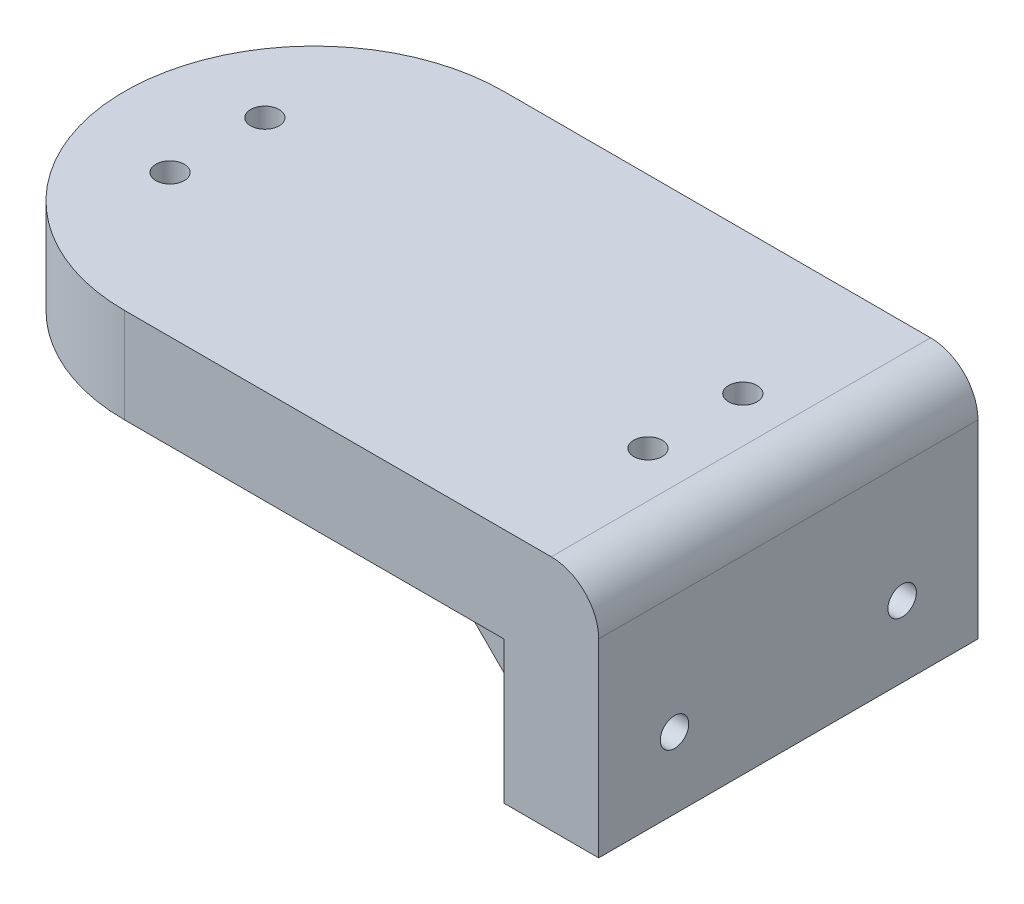
ISO-10303-21;
HEADER;
FILE_DESCRIPTION(('STEP AP214'),'2;1');
FILE_NAME('part.step','',(''),(''),'','','');
FILE_SCHEMA(('AUTOMOTIVE_DESIGN { 1 0 10303 214 1 1 1 1 }'));
ENDSEC;
DATA;
#1=APPLICATION_CONTEXT('core data for automotive mechanical design processes');
#2=APPLICATION_PROTOCOL_DEFINITION('international standard','automotive_design',2000,#1);
#3=PRODUCT_CONTEXT('',#1,'mechanical');
#4=PRODUCT('Part','Part','',(#3));
#5=PRODUCT_RELATED_PRODUCT_CATEGORY('part','',(#4));
#6=PRODUCT_DEFINITION_FORMATION('','',#4);
#7=PRODUCT_DEFINITION_CONTEXT('part definition',#1,'design');
#8=PRODUCT_DEFINITION('design','',#6,#7);
#9=PRODUCT_DEFINITION_SHAPE('','',#8);
#10=(LENGTH_UNIT() NAMED_UNIT(*) SI_UNIT(.MILLI.,.METRE.));
#11=(NAMED_UNIT(*) PLANE_ANGLE_UNIT() SI_UNIT($,.RADIAN.));
#12=(NAMED_UNIT(*) SI_UNIT($,.STERADIAN.) SOLID_ANGLE_UNIT());
#13=UNCERTAINTY_MEASURE_WITH_UNIT(LENGTH_MEASURE(1.E-05),#10,'distance_accuracy_value','');
#14=(GEOMETRIC_REPRESENTATION_CONTEXT(3) GLOBAL_UNCERTAINTY_ASSIGNED_CONTEXT((#13)) GLOBAL_UNIT_ASSIGNED_CONTEXT((#10,
#11,#12)) REPRESENTATION_CONTEXT('',''));
#15=CARTESIAN_POINT('',(0.,0.,0.));
#16=DIRECTION('',(0.,0.,1.));
#17=DIRECTION('',(1.,0.,0.));
#18=AXIS2_PLACEMENT_3D('',#15,#16,#17);
#19=CARTESIAN_POINT('',(60.,-10.,4.));
#20=DIRECTION('',(0.,1.,0.));
#21=DIRECTION('',(-1.,0.,0.));
#22=AXIS2_PLACEMENT_3D('',#19,#20,#21);
#23=PLANE('',#22);
#24=DIRECTION('',(1.,0.,0.));
#25=VECTOR('',#24,1.);
#26=CARTESIAN_POINT('',(60.,-10.,2.));
#27=LINE('',#26,#25);
#28=CARTESIAN_POINT('',(52.9289321881345,-10.,2.));
#29=VERTEX_POINT('',#28);
#30=CARTESIAN_POINT('',(60.,-10.,2.));
#31=VERTEX_POINT('',#30);
#32=EDGE_CURVE('E99',#29,#31,#27,.T.);
#33=ORIENTED_EDGE('',*,*,#32,.F.);
#34=DIRECTION('',(0.,0.,-1.));
#35=VECTOR('',#34,1.);
#36=CARTESIAN_POINT('',(52.9289321881345,-10.,4.));
#37=LINE('',#36,#35);
#38=CARTESIAN_POINT('',(52.9289321881345,-10.,4.));
#39=VERTEX_POINT('',#38);
#40=EDGE_CURVE('E12',#39,#29,#37,.T.);
#41=ORIENTED_EDGE('',*,*,#40,.F.);
#42=DIRECTION('',(1.,0.,0.));
#43=VECTOR('',#42,1.);
#44=CARTESIAN_POINT('',(60.,-10.,4.));
#45=LINE('',#44,#43);
#46=CARTESIAN_POINT('',(60.,-10.,4.));
#47=VERTEX_POINT('',#46);
#48=EDGE_CURVE('E91',#39,#47,#45,.T.);
#49=ORIENTED_EDGE('',*,*,#48,.T.);
#50=DIRECTION('',(0.,0.,-1.));
#51=VECTOR('',#50,1.);
#52=CARTESIAN_POINT('',(60.,-10.,4.));
#53=LINE('',#52,#51);
#54=EDGE_CURVE('E50',#47,#31,#53,.T.);
#55=ORIENTED_EDGE('',*,*,#54,.T.);
#56=EDGE_LOOP('',(#33,#41,#49,#55));
#57=FACE_BOUND('',#56,.T.);
#58=ADVANCED_FACE('F47',(#57),#23,.T.);
#59=CARTESIAN_POINT('',(52.9289321881345,-10.,4.));
#60=DIRECTION('',(-0.707106781186546,-0.707106781186549,0.));
#61=DIRECTION('',(0.707106781186549,-0.707106781186546,0.));
#62=AXIS2_PLACEMENT_3D('',#59,#60,#61);
#63=PLANE('',#62);
#64=DIRECTION('',(-0.707106781186549,0.707106781186546,0.));
#65=VECTOR('',#64,1.);
#66=CARTESIAN_POINT('',(52.9289321881345,-10.,2.));
#67=LINE('',#66,#65);
#68=CARTESIAN_POINT('',(60.,-17.0710678118655,2.));
#69=VERTEX_POINT('',#68);
#70=EDGE_CURVE('E93',#69,#29,#67,.T.);
#71=ORIENTED_EDGE('',*,*,#70,.F.);
#72=DIRECTION('',(0.,0.,-1.));
#73=VECTOR('',#72,1.);
#74=CARTESIAN_POINT('',(60.,-17.0710678118655,4.));
#75=LINE('',#74,#73);
#76=CARTESIAN_POINT('',(60.,-17.0710678118655,4.));
#77=VERTEX_POINT('',#76);
#78=EDGE_CURVE('E56',#77,#69,#75,.T.);
#79=ORIENTED_EDGE('',*,*,#78,.F.);
#80=DIRECTION('',(-0.707106781186549,0.707106781186546,0.));
#81=VECTOR('',#80,1.);
#82=CARTESIAN_POINT('',(52.9289321881345,-10.,4.));
#83=LINE('',#82,#81);
#84=EDGE_CURVE('E88',#77,#39,#83,.T.);
#85=ORIENTED_EDGE('',*,*,#84,.T.);
#86=ORIENTED_EDGE('',*,*,#40,.T.);
#87=EDGE_LOOP('',(#71,#79,#85,#86));
#88=FACE_BOUND('',#87,.T.);
#89=ADVANCED_FACE('F103',(#88),#63,.T.);
#90=CARTESIAN_POINT('',(60.,-10.,4.));
#91=DIRECTION('',(1.,0.,0.));
#92=DIRECTION('',(0.,1.,0.));
#93=AXIS2_PLACEMENT_3D('',#90,#91,#92);
#94=PLANE('',#93);
#95=DIRECTION('',(0.,-1.,0.));
#96=VECTOR('',#95,1.);
#97=CARTESIAN_POINT('',(60.,-10.,2.));
#98=LINE('',#97,#96);
#99=EDGE_CURVE('E86',#31,#69,#98,.T.);
#100=ORIENTED_EDGE('',*,*,#99,.F.);
#101=ORIENTED_EDGE('',*,*,#54,.F.);
#102=DIRECTION('',(0.,-1.,0.));
#103=VECTOR('',#102,1.);
#104=CARTESIAN_POINT('',(60.,-10.,4.));
#105=LINE('',#104,#103);
#106=EDGE_CURVE('E84',#47,#77,#105,.T.);
#107=ORIENTED_EDGE('',*,*,#106,.T.);
#108=ORIENTED_EDGE('',*,*,#78,.T.);
#109=EDGE_LOOP('',(#100,#101,#107,#108));
#110=FACE_BOUND('',#109,.T.);
#111=ADVANCED_FACE('F83',(#110),#94,.T.);
#112=CARTESIAN_POINT('',(0.,0.,4.));
#113=DIRECTION('',(0.,0.,1.));
#114=DIRECTION('',(1.,0.,0.));
#115=AXIS2_PLACEMENT_3D('',#112,#113,#114);
#116=PLANE('',#115);
#117=ORIENTED_EDGE('',*,*,#48,.F.);
#118=ORIENTED_EDGE('',*,*,#84,.F.);
#119=ORIENTED_EDGE('',*,*,#106,.F.);
#120=EDGE_LOOP('',(#117,#118,#119));
#121=FACE_BOUND('',#120,.T.);
#122=ADVANCED_FACE('F90',(#121),#116,.T.);
#123=CARTESIAN_POINT('',(0.,0.,2.));
#124=DIRECTION('',(0.,0.,1.));
#125=DIRECTION('',(1.,0.,0.));
#126=AXIS2_PLACEMENT_3D('',#123,#124,#125);
#127=PLANE('',#126);
#128=ORIENTED_EDGE('',*,*,#32,.T.);
#129=ORIENTED_EDGE('',*,*,#99,.T.);
#130=ORIENTED_EDGE('',*,*,#70,.T.);
#131=EDGE_LOOP('',(#128,#129,#130));
#132=FACE_BOUND('',#131,.T.);
#133=ADVANCED_FACE('F102',(#132),#127,.F.);
#134=CLOSED_SHELL('',(#58,#89,#111,#122,#133));
#135=MANIFOLD_SOLID_BREP('B2',#134);
#136=CARTESIAN_POINT('',(20.,-10.,20.));
#137=DIRECTION('',(0.,-1.,0.));
#138=DIRECTION('',(0.,0.,-1.));
#139=AXIS2_PLACEMENT_3D('',#136,#137,#138);
#140=CYLINDRICAL_SURFACE('',#139,20.);
#141=DIRECTION('',(0.,-1.,0.));
#142=VECTOR('',#141,1.);
#143=CARTESIAN_POINT('',(20.,0.,0.));
#144=LINE('',#143,#142);
#145=CARTESIAN_POINT('',(20.,-10.,0.));
#146=VERTEX_POINT('',#145);
#147=CARTESIAN_POINT('',(20.,0.,0.));
#148=VERTEX_POINT('',#147);
#149=EDGE_CURVE('E323',#146,#148,#144,.F.);
#150=ORIENTED_EDGE('',*,*,#149,.F.);
#151=CARTESIAN_POINT('',(20.,-10.,20.));
#152=DIRECTION('',(0.,1.,0.));
#153=DIRECTION('',(0.,0.,1.));
#154=AXIS2_PLACEMENT_3D('',#151,#152,#153);
#155=CIRCLE('',#154,20.);
#156=CARTESIAN_POINT('',(20.,-10.,40.));
#157=VERTEX_POINT('',#156);
#158=EDGE_CURVE('E153',#157,#146,#155,.F.);
#159=ORIENTED_EDGE('',*,*,#158,.F.);
#160=DIRECTION('',(0.,1.,0.));
#161=VECTOR('',#160,1.);
#162=CARTESIAN_POINT('',(20.,-10.,40.));
#163=LINE('',#162,#161);
#164=CARTESIAN_POINT('',(20.,0.,40.));
#165=VERTEX_POINT('',#164);
#166=EDGE_CURVE('E326',#165,#157,#163,.F.);
#167=ORIENTED_EDGE('',*,*,#166,.F.);
#168=CARTESIAN_POINT('',(20.,0.,20.));
#169=DIRECTION('',(0.,-1.,0.));
#170=DIRECTION('',(0.,0.,-1.));
#171=AXIS2_PLACEMENT_3D('',#168,#169,#170);
#172=CIRCLE('',#171,20.);
#173=EDGE_CURVE('E45',#148,#165,#172,.F.);
#174=ORIENTED_EDGE('',*,*,#173,.F.);
#175=EDGE_LOOP('',(#150,#159,#167,#174));
#176=FACE_BOUND('',#175,.T.);
#177=ADVANCED_FACE('F145',(#176),#140,.T.);
#178=CARTESIAN_POINT('',(57.,-13.,40.));
#179=DIRECTION('',(0.,0.,-1.));
#180=DIRECTION('',(-1.,0.,0.));
#181=AXIS2_PLACEMENT_3D('',#178,#179,#180);
#182=CYLINDRICAL_SURFACE('',#181,3.);
#183=DIRECTION('',(0.,0.,1.));
#184=VECTOR('',#183,1.);
#185=CARTESIAN_POINT('',(57.,-10.,40.));
#186=LINE('',#185,#184);
#187=CARTESIAN_POINT('',(57.,-10.,0.));
#188=VERTEX_POINT('',#187);
#189=CARTESIAN_POINT('',(57.,-10.,36.));
#190=VERTEX_POINT('',#189);
#191=EDGE_CURVE('E234',#188,#190,#186,.T.);
#192=ORIENTED_EDGE('',*,*,#191,.F.);
#193=CARTESIAN_POINT('',(57.,-13.,0.));
#194=DIRECTION('',(0.,0.,1.));
#195=DIRECTION('',(1.,0.,0.));
#196=AXIS2_PLACEMENT_3D('',#193,#194,#195);
#197=CIRCLE('',#196,3.);
#198=CARTESIAN_POINT('',(60.,-13.,0.));
#199=VERTEX_POINT('',#198);
#200=EDGE_CURVE('E321',#188,#199,#197,.F.);
#201=ORIENTED_EDGE('',*,*,#200,.T.);
#202=DIRECTION('',(0.,0.,1.));
#203=VECTOR('',#202,1.);
#204=CARTESIAN_POINT('',(60.,-13.,40.));
#205=LINE('',#204,#203);
#206=CARTESIAN_POINT('',(60.,-13.,36.));
#207=VERTEX_POINT('',#206);
#208=EDGE_CURVE('E318',#207,#199,#205,.F.);
#209=ORIENTED_EDGE('',*,*,#208,.F.);
#210=CARTESIAN_POINT('',(57.,-13.,36.));
#211=DIRECTION('',(0.,0.,1.));
#212=DIRECTION('',(1.,0.,0.));
#213=AXIS2_PLACEMENT_3D('',#210,#211,#212);
#214=CIRCLE('',#213,3.);
#215=EDGE_CURVE('E316',#190,#207,#214,.F.);
#216=ORIENTED_EDGE('',*,*,#215,.F.);
#217=EDGE_LOOP('',(#192,#201,#209,#216));
#218=FACE_BOUND('',#217,.T.);
#219=ADVANCED_FACE('F336',(#218),#182,.F.);
#220=CARTESIAN_POINT('',(60.,-10.,40.));
#221=DIRECTION('',(1.,0.,0.));
#222=DIRECTION('',(0.,0.,-1.));
#223=AXIS2_PLACEMENT_3D('',#220,#221,#222);
#224=PLANE('',#223);
#225=CARTESIAN_POINT('',(60.,-17.5,8.));
#226=DIRECTION('',(-1.,0.,0.));
#227=DIRECTION('',(0.,0.,1.));
#228=AXIS2_PLACEMENT_3D('',#225,#226,#227);
#229=CIRCLE('',#228,1.5);
#230=CARTESIAN_POINT('',(60.,-17.5,9.50000000000001));
#231=VERTEX_POINT('',#230);
#232=EDGE_CURVE('E263',#231,#231,#229,.T.);
#233=ORIENTED_EDGE('',*,*,#232,.F.);
#234=EDGE_LOOP('',(#233));
#235=FACE_BOUND('',#234,.T.);
#236=CARTESIAN_POINT('',(60.,-17.5,32.));
#237=DIRECTION('',(-1.,0.,0.));
#238=DIRECTION('',(0.,0.,1.));
#239=AXIS2_PLACEMENT_3D('',#236,#237,#238);
#240=CIRCLE('',#239,1.5);
#241=CARTESIAN_POINT('',(60.,-17.5,33.5));
#242=VERTEX_POINT('',#241);
#243=EDGE_CURVE('E261',#242,#242,#240,.F.);
#244=ORIENTED_EDGE('',*,*,#243,.T.);
#245=EDGE_LOOP('',(#244));
#246=FACE_BOUND('',#245,.T.);
#247=DIRECTION('',(0.,1.,0.));
#248=VECTOR('',#247,1.);
#249=CARTESIAN_POINT('',(60.,-17.0710678118655,36.));
#250=LINE('',#249,#248);
#251=CARTESIAN_POINT('',(60.,-17.0710678118655,36.));
#252=VERTEX_POINT('',#251);
#253=EDGE_CURVE('E239',#252,#207,#250,.T.);
#254=ORIENTED_EDGE('',*,*,#253,.T.);
#255=ORIENTED_EDGE('',*,*,#208,.T.);
#256=DIRECTION('',(0.,-1.,0.));
#257=VECTOR('',#256,1.);
#258=CARTESIAN_POINT('',(60.,-10.,0.));
#259=LINE('',#258,#257);
#260=CARTESIAN_POINT('',(60.,-25.,0.));
#261=VERTEX_POINT('',#260);
#262=EDGE_CURVE('E285',#199,#261,#259,.T.);
#263=ORIENTED_EDGE('',*,*,#262,.T.);
#264=DIRECTION('',(0.,0.,-1.));
#265=VECTOR('',#264,1.);
#266=CARTESIAN_POINT('',(60.,-25.,40.));
#267=LINE('',#266,#265);
#268=CARTESIAN_POINT('',(60.,-25.,40.));
#269=VERTEX_POINT('',#268);
#270=EDGE_CURVE('E296',#269,#261,#267,.T.);
#271=ORIENTED_EDGE('',*,*,#270,.F.);
#272=DIRECTION('',(0.,-1.,0.));
#273=VECTOR('',#272,1.);
#274=CARTESIAN_POINT('',(60.,-10.,40.));
#275=LINE('',#274,#273);
#276=CARTESIAN_POINT('',(60.,-10.,40.));
#277=VERTEX_POINT('',#276);
#278=EDGE_CURVE('E271',#277,#269,#275,.T.);
#279=ORIENTED_EDGE('',*,*,#278,.F.);
#280=DIRECTION('',(0.,0.,-1.));
#281=VECTOR('',#280,1.);
#282=CARTESIAN_POINT('',(60.,-10.,40.));
#283=LINE('',#282,#281);
#284=CARTESIAN_POINT('',(60.,-10.,38.));
#285=VERTEX_POINT('',#284);
#286=EDGE_CURVE('E299',#277,#285,#283,.T.);
#287=ORIENTED_EDGE('',*,*,#286,.T.);
#288=DIRECTION('',(0.,1.,0.));
#289=VECTOR('',#288,1.);
#290=CARTESIAN_POINT('',(60.,-17.0710678118655,38.));
#291=LINE('',#290,#289);
#292=CARTESIAN_POINT('',(60.,-17.0710678118655,38.));
#293=VERTEX_POINT('',#292);
#294=EDGE_CURVE('E255',#293,#285,#291,.T.);
#295=ORIENTED_EDGE('',*,*,#294,.F.);
#296=DIRECTION('',(0.,0.,1.));
#297=VECTOR('',#296,1.);
#298=CARTESIAN_POINT('',(60.,-17.0710678118655,36.));
#299=LINE('',#298,#297);
#300=EDGE_CURVE('E248',#252,#293,#299,.T.);
#301=ORIENTED_EDGE('',*,*,#300,.F.);
#302=EDGE_LOOP('',(#254,#255,#263,#271,#279,#287,#295,#301));
#303=FACE_BOUND('',#302,.T.);
#304=ADVANCED_FACE('F338',(#235,#246,#303),#224,.F.);
#305=CARTESIAN_POINT('',(0.,-10.,40.));
#306=DIRECTION('',(0.,1.,0.));
#307=DIRECTION('',(0.,0.,1.));
#308=AXIS2_PLACEMENT_3D('',#305,#306,#307);
#309=PLANE('',#308);
#310=CARTESIAN_POINT('',(9.8,-10.,25.));
#311=DIRECTION('',(0.,-1.,0.));
#312=DIRECTION('',(0.,0.,-1.));
#313=AXIS2_PLACEMENT_3D('',#310,#311,#312);
#314=CIRCLE('',#313,1.5);
#315=CARTESIAN_POINT('',(9.8,-10.,23.5));
#316=VERTEX_POINT('',#315);
#317=EDGE_CURVE('E347',#316,#316,#314,.T.);
#318=ORIENTED_EDGE('',*,*,#317,.F.);
#319=EDGE_LOOP('',(#318));
#320=FACE_BOUND('',#319,.T.);
#321=CARTESIAN_POINT('',(9.79999999999998,-10.,15.));
#322=DIRECTION('',(0.,-1.,0.));
#323=DIRECTION('',(0.,0.,-1.));
#324=AXIS2_PLACEMENT_3D('',#321,#322,#323);
#325=CIRCLE('',#324,1.5);
#326=CARTESIAN_POINT('',(9.79999999999998,-10.,13.5));
#327=VERTEX_POINT('',#326);
#328=EDGE_CURVE('E359',#327,#327,#325,.T.);
#329=ORIENTED_EDGE('',*,*,#328,.F.);
#330=EDGE_LOOP('',(#329));
#331=FACE_BOUND('',#330,.T.);
#332=DIRECTION('',(1.,0.,0.));
#333=VECTOR('',#332,1.);
#334=CARTESIAN_POINT('',(0.,-10.,40.));
#335=LINE('',#334,#333);
#336=EDGE_CURVE('E269',#157,#277,#335,.T.);
#337=ORIENTED_EDGE('',*,*,#336,.F.);
#338=ORIENTED_EDGE('',*,*,#158,.T.);
#339=DIRECTION('',(1.,0.,0.));
#340=VECTOR('',#339,1.);
#341=CARTESIAN_POINT('',(0.,-10.,0.));
#342=LINE('',#341,#340);
#343=EDGE_CURVE('E283',#146,#188,#342,.T.);
#344=ORIENTED_EDGE('',*,*,#343,.T.);
#345=ORIENTED_EDGE('',*,*,#191,.T.);
#346=DIRECTION('',(-1.,0.,0.));
#347=VECTOR('',#346,1.);
#348=CARTESIAN_POINT('',(60.,-10.,36.));
#349=LINE('',#348,#347);
#350=CARTESIAN_POINT('',(52.9289321881345,-10.,36.));
#351=VERTEX_POINT('',#350);
#352=EDGE_CURVE('E227',#190,#351,#349,.T.);
#353=ORIENTED_EDGE('',*,*,#352,.T.);
#354=DIRECTION('',(0.,0.,1.));
#355=VECTOR('',#354,1.);
#356=CARTESIAN_POINT('',(52.9289321881345,-10.,36.));
#357=LINE('',#356,#355);
#358=CARTESIAN_POINT('',(52.9289321881345,-10.,38.));
#359=VERTEX_POINT('',#358);
#360=EDGE_CURVE('E232',#351,#359,#357,.T.);
#361=ORIENTED_EDGE('',*,*,#360,.T.);
#362=DIRECTION('',(-1.,0.,0.));
#363=VECTOR('',#362,1.);
#364=CARTESIAN_POINT('',(60.,-10.,38.));
#365=LINE('',#364,#363);
#366=EDGE_CURVE('E257',#285,#359,#365,.T.);
#367=ORIENTED_EDGE('',*,*,#366,.F.);
#368=ORIENTED_EDGE('',*,*,#286,.F.);
#369=EDGE_LOOP('',(#337,#338,#344,#345,#353,#361,#367,#368));
#370=FACE_BOUND('',#369,.T.);
#371=ADVANCED_FACE('F230',(#320,#331,#370),#309,.F.);
#372=CARTESIAN_POINT('',(70.,0.,40.));
#373=DIRECTION('',(-1.,0.,0.));
#374=DIRECTION('',(0.,0.,1.));
#375=AXIS2_PLACEMENT_3D('',#372,#373,#374);
#376=PLANE('',#375);
#377=DIRECTION('',(0.,1.,0.));
#378=VECTOR('',#377,1.);
#379=CARTESIAN_POINT('',(70.,0.,0.));
#380=LINE('',#379,#378);
#381=CARTESIAN_POINT('',(70.,-25.,0.));
#382=VERTEX_POINT('',#381);
#383=CARTESIAN_POINT('',(70.,-5.,0.));
#384=VERTEX_POINT('',#383);
#385=EDGE_CURVE('E290',#382,#384,#380,.T.);
#386=ORIENTED_EDGE('',*,*,#385,.T.);
#387=DIRECTION('',(0.,0.,-1.));
#388=VECTOR('',#387,1.);
#389=CARTESIAN_POINT('',(70.,-5.,40.));
#390=LINE('',#389,#388);
#391=CARTESIAN_POINT('',(70.,-5.,40.));
#392=VERTEX_POINT('',#391);
#393=EDGE_CURVE('E311',#384,#392,#390,.F.);
#394=ORIENTED_EDGE('',*,*,#393,.T.);
#395=DIRECTION('',(0.,1.,0.));
#396=VECTOR('',#395,1.);
#397=CARTESIAN_POINT('',(70.,0.,40.));
#398=LINE('',#397,#396);
#399=CARTESIAN_POINT('',(70.,-25.,40.));
#400=VERTEX_POINT('',#399);
#401=EDGE_CURVE('E276',#400,#392,#398,.T.);
#402=ORIENTED_EDGE('',*,*,#401,.F.);
#403=DIRECTION('',(0.,0.,-1.));
#404=VECTOR('',#403,1.);
#405=CARTESIAN_POINT('',(70.,-25.,40.));
#406=LINE('',#405,#404);
#407=EDGE_CURVE('E282',#400,#382,#406,.T.);
#408=ORIENTED_EDGE('',*,*,#407,.T.);
#409=EDGE_LOOP('',(#386,#394,#402,#408));
#410=FACE_BOUND('',#409,.T.);
#411=CARTESIAN_POINT('',(70.,-17.5,32.));
#412=DIRECTION('',(-1.,0.,0.));
#413=DIRECTION('',(0.,0.,1.));
#414=AXIS2_PLACEMENT_3D('',#411,#412,#413);
#415=CIRCLE('',#414,1.5);
#416=CARTESIAN_POINT('',(70.,-17.5,33.5));
#417=VERTEX_POINT('',#416);
#418=EDGE_CURVE('E266',#417,#417,#415,.F.);
#419=ORIENTED_EDGE('',*,*,#418,.F.);
#420=EDGE_LOOP('',(#419));
#421=FACE_BOUND('',#420,.T.);
#422=CARTESIAN_POINT('',(70.,-17.5,8.));
#423=DIRECTION('',(-1.,0.,0.));
#424=DIRECTION('',(0.,0.,1.));
#425=AXIS2_PLACEMENT_3D('',#422,#423,#424);
#426=CIRCLE('',#425,1.5);
#427=CARTESIAN_POINT('',(70.,-17.5,9.50000000000001));
#428=VERTEX_POINT('',#427);
#429=EDGE_CURVE('E286',#428,#428,#426,.T.);
#430=ORIENTED_EDGE('',*,*,#429,.T.);
#431=EDGE_LOOP('',(#430));
#432=FACE_BOUND('',#431,.T.);
#433=ADVANCED_FACE('F377',(#410,#421,#432),#376,.F.);
#434=CARTESIAN_POINT('',(60.,-25.,40.));
#435=DIRECTION('',(0.,1.,0.));
#436=DIRECTION('',(0.,0.,1.));
#437=AXIS2_PLACEMENT_3D('',#434,#435,#436);
#438=PLANE('',#437);
#439=DIRECTION('',(1.,0.,0.));
#440=VECTOR('',#439,1.);
#441=CARTESIAN_POINT('',(60.,-25.,0.));
#442=LINE('',#441,#440);
#443=EDGE_CURVE('E288',#261,#382,#442,.T.);
#444=ORIENTED_EDGE('',*,*,#443,.T.);
#445=ORIENTED_EDGE('',*,*,#407,.F.);
#446=DIRECTION('',(1.,0.,0.));
#447=VECTOR('',#446,1.);
#448=CARTESIAN_POINT('',(60.,-25.,40.));
#449=LINE('',#448,#447);
#450=EDGE_CURVE('E274',#269,#400,#449,.T.);
#451=ORIENTED_EDGE('',*,*,#450,.F.);
#452=ORIENTED_EDGE('',*,*,#270,.T.);
#453=EDGE_LOOP('',(#444,#445,#451,#452));
#454=FACE_BOUND('',#453,.T.);
#455=ADVANCED_FACE('F384',(#454),#438,.F.);
#456=CARTESIAN_POINT('',(0.,0.,40.));
#457=DIRECTION('',(0.,-1.,0.));
#458=DIRECTION('',(0.,0.,-1.));
#459=AXIS2_PLACEMENT_3D('',#456,#457,#458);
#460=PLANE('',#459);
#461=CARTESIAN_POINT('',(60.2,0.,15.0000000000001));
#462=DIRECTION('',(0.,-1.,0.));
#463=DIRECTION('',(0.,0.,-1.));
#464=AXIS2_PLACEMENT_3D('',#461,#462,#463);
#465=CIRCLE('',#464,1.5);
#466=CARTESIAN_POINT('',(60.2,0.,13.5000000000001));
#467=VERTEX_POINT('',#466);
#468=EDGE_CURVE('E344',#467,#467,#465,.T.);
#469=ORIENTED_EDGE('',*,*,#468,.T.);
#470=EDGE_LOOP('',(#469));
#471=FACE_BOUND('',#470,.T.);
#472=CARTESIAN_POINT('',(9.8,0.,25.));
#473=DIRECTION('',(0.,-1.,0.));
#474=DIRECTION('',(0.,0.,-1.));
#475=AXIS2_PLACEMENT_3D('',#472,#473,#474);
#476=CIRCLE('',#475,1.5);
#477=CARTESIAN_POINT('',(9.8,0.,23.5));
#478=VERTEX_POINT('',#477);
#479=EDGE_CURVE('E350',#478,#478,#476,.T.);
#480=ORIENTED_EDGE('',*,*,#479,.T.);
#481=EDGE_LOOP('',(#480));
#482=FACE_BOUND('',#481,.T.);
#483=CARTESIAN_POINT('',(9.79999999999998,0.,15.));
#484=DIRECTION('',(0.,-1.,0.));
#485=DIRECTION('',(0.,0.,-1.));
#486=AXIS2_PLACEMENT_3D('',#483,#484,#485);
#487=CIRCLE('',#486,1.5);
#488=CARTESIAN_POINT('',(9.79999999999998,0.,13.5));
#489=VERTEX_POINT('',#488);
#490=EDGE_CURVE('E351',#489,#489,#487,.T.);
#491=ORIENTED_EDGE('',*,*,#490,.T.);
#492=EDGE_LOOP('',(#491));
#493=FACE_BOUND('',#492,.T.);
#494=CARTESIAN_POINT('',(60.2,0.,25.0000000000001));
#495=DIRECTION('',(0.,-1.,0.));
#496=DIRECTION('',(0.,0.,-1.));
#497=AXIS2_PLACEMENT_3D('',#494,#495,#496);
#498=CIRCLE('',#497,1.5);
#499=CARTESIAN_POINT('',(60.2,0.,23.5000000000001));
#500=VERTEX_POINT('',#499);
#501=EDGE_CURVE('E258',#500,#500,#498,.T.);
#502=ORIENTED_EDGE('',*,*,#501,.T.);
#503=EDGE_LOOP('',(#502));
#504=FACE_BOUND('',#503,.T.);
#505=DIRECTION('',(-1.,0.,0.));
#506=VECTOR('',#505,1.);
#507=CARTESIAN_POINT('',(0.,0.,0.));
#508=LINE('',#507,#506);
#509=CARTESIAN_POINT('',(65.,0.,0.));
#510=VERTEX_POINT('',#509);
#511=EDGE_CURVE('E272',#510,#148,#508,.T.);
#512=ORIENTED_EDGE('',*,*,#511,.T.);
#513=ORIENTED_EDGE('',*,*,#173,.T.);
#514=DIRECTION('',(-1.,0.,0.));
#515=VECTOR('',#514,1.);
#516=CARTESIAN_POINT('',(0.,0.,40.));
#517=LINE('',#516,#515);
#518=CARTESIAN_POINT('',(65.,0.,40.));
#519=VERTEX_POINT('',#518);
#520=EDGE_CURVE('E279',#519,#165,#517,.T.);
#521=ORIENTED_EDGE('',*,*,#520,.F.);
#522=DIRECTION('',(0.,0.,-1.));
#523=VECTOR('',#522,1.);
#524=CARTESIAN_POINT('',(65.,0.,40.));
#525=LINE('',#524,#523);
#526=EDGE_CURVE('E302',#519,#510,#525,.T.);
#527=ORIENTED_EDGE('',*,*,#526,.T.);
#528=EDGE_LOOP('',(#512,#513,#521,#527));
#529=FACE_BOUND('',#528,.T.);
#530=ADVANCED_FACE('F365',(#471,#482,#493,#504,#529),#460,.F.);
#531=CARTESIAN_POINT('',(0.,0.,40.));
#532=DIRECTION('',(0.,0.,1.));
#533=DIRECTION('',(1.,0.,0.));
#534=AXIS2_PLACEMENT_3D('',#531,#532,#533);
#535=PLANE('',#534);
#536=ORIENTED_EDGE('',*,*,#520,.T.);
#537=ORIENTED_EDGE('',*,*,#166,.T.);
#538=ORIENTED_EDGE('',*,*,#336,.T.);
#539=ORIENTED_EDGE('',*,*,#278,.T.);
#540=ORIENTED_EDGE('',*,*,#450,.T.);
#541=ORIENTED_EDGE('',*,*,#401,.T.);
#542=CARTESIAN_POINT('',(65.,-5.,40.));
#543=DIRECTION('',(0.,0.,1.));
#544=DIRECTION('',(1.,0.,0.));
#545=AXIS2_PLACEMENT_3D('',#542,#543,#544);
#546=CIRCLE('',#545,5.);
#547=EDGE_CURVE('E313',#392,#519,#546,.T.);
#548=ORIENTED_EDGE('',*,*,#547,.T.);
#549=EDGE_LOOP('',(#536,#537,#538,#539,#540,#541,#548));
#550=FACE_BOUND('',#549,.T.);
#551=ADVANCED_FACE('F414',(#550),#535,.T.);
#552=CARTESIAN_POINT('',(0.,0.,0.));
#553=DIRECTION('',(0.,0.,1.));
#554=DIRECTION('',(1.,0.,0.));
#555=AXIS2_PLACEMENT_3D('',#552,#553,#554);
#556=PLANE('',#555);
#557=ORIENTED_EDGE('',*,*,#343,.F.);
#558=ORIENTED_EDGE('',*,*,#149,.T.);
#559=ORIENTED_EDGE('',*,*,#511,.F.);
#560=CARTESIAN_POINT('',(65.,-5.,0.));
#561=DIRECTION('',(0.,0.,1.));
#562=DIRECTION('',(1.,0.,0.));
#563=AXIS2_PLACEMENT_3D('',#560,#561,#562);
#564=CIRCLE('',#563,5.);
#565=EDGE_CURVE('E309',#510,#384,#564,.F.);
#566=ORIENTED_EDGE('',*,*,#565,.T.);
#567=ORIENTED_EDGE('',*,*,#385,.F.);
#568=ORIENTED_EDGE('',*,*,#443,.F.);
#569=ORIENTED_EDGE('',*,*,#262,.F.);
#570=ORIENTED_EDGE('',*,*,#200,.F.);
#571=EDGE_LOOP('',(#557,#558,#559,#566,#567,#568,#569,#570));
#572=FACE_BOUND('',#571,.T.);
#573=ADVANCED_FACE('F332',(#572),#556,.F.);
#574=CARTESIAN_POINT('',(100.,-17.5,32.));
#575=DIRECTION('',(-1.,0.,0.));
#576=DIRECTION('',(0.,0.,1.));
#577=AXIS2_PLACEMENT_3D('',#574,#575,#576);
#578=CYLINDRICAL_SURFACE('',#577,1.5);
#579=ORIENTED_EDGE('',*,*,#243,.F.);
#580=EDGE_LOOP('',(#579));
#581=FACE_BOUND('',#580,.T.);
#582=ORIENTED_EDGE('',*,*,#418,.T.);
#583=EDGE_LOOP('',(#582));
#584=FACE_BOUND('',#583,.T.);
#585=ADVANCED_FACE('F433',(#581,#584),#578,.F.);
#586=CARTESIAN_POINT('',(100.,-17.5,8.));
#587=DIRECTION('',(-1.,0.,0.));
#588=DIRECTION('',(0.,0.,1.));
#589=AXIS2_PLACEMENT_3D('',#586,#587,#588);
#590=CYLINDRICAL_SURFACE('',#589,1.5);
#591=ORIENTED_EDGE('',*,*,#232,.T.);
#592=EDGE_LOOP('',(#591));
#593=FACE_BOUND('',#592,.T.);
#594=ORIENTED_EDGE('',*,*,#429,.F.);
#595=EDGE_LOOP('',(#594));
#596=FACE_BOUND('',#595,.T.);
#597=ADVANCED_FACE('F438',(#593,#596),#590,.F.);
#598=CARTESIAN_POINT('',(52.9289321881345,-10.,36.));
#599=DIRECTION('',(-0.707106781186546,-0.707106781186549,0.));
#600=DIRECTION('',(0.707106781186549,-0.707106781186546,0.));
#601=AXIS2_PLACEMENT_3D('',#598,#599,#600);
#602=PLANE('',#601);
#603=DIRECTION('',(0.707106781186549,-0.707106781186546,0.));
#604=VECTOR('',#603,1.);
#605=CARTESIAN_POINT('',(52.9289321881345,-10.,38.));
#606=LINE('',#605,#604);
#607=EDGE_CURVE('E247',#359,#293,#606,.T.);
#608=ORIENTED_EDGE('',*,*,#607,.F.);
#609=ORIENTED_EDGE('',*,*,#360,.F.);
#610=DIRECTION('',(0.707106781186549,-0.707106781186546,0.));
#611=VECTOR('',#610,1.);
#612=CARTESIAN_POINT('',(52.9289321881345,-10.,36.));
#613=LINE('',#612,#611);
#614=EDGE_CURVE('E238',#351,#252,#613,.T.);
#615=ORIENTED_EDGE('',*,*,#614,.T.);
#616=ORIENTED_EDGE('',*,*,#300,.T.);
#617=EDGE_LOOP('',(#608,#609,#615,#616));
#618=FACE_BOUND('',#617,.T.);
#619=ADVANCED_FACE('F244',(#618),#602,.T.);
#620=CARTESIAN_POINT('',(0.,0.,36.));
#621=DIRECTION('',(0.,0.,1.));
#622=DIRECTION('',(1.,0.,0.));
#623=AXIS2_PLACEMENT_3D('',#620,#621,#622);
#624=PLANE('',#623);
#625=ORIENTED_EDGE('',*,*,#352,.F.);
#626=ORIENTED_EDGE('',*,*,#215,.T.);
#627=ORIENTED_EDGE('',*,*,#253,.F.);
#628=ORIENTED_EDGE('',*,*,#614,.F.);
#629=EDGE_LOOP('',(#625,#626,#627,#628));
#630=FACE_BOUND('',#629,.T.);
#631=ADVANCED_FACE('F250',(#630),#624,.F.);
#632=CARTESIAN_POINT('',(0.,0.,38.));
#633=DIRECTION('',(0.,0.,1.));
#634=DIRECTION('',(1.,0.,0.));
#635=AXIS2_PLACEMENT_3D('',#632,#633,#634);
#636=PLANE('',#635);
#637=ORIENTED_EDGE('',*,*,#294,.T.);
#638=ORIENTED_EDGE('',*,*,#366,.T.);
#639=ORIENTED_EDGE('',*,*,#607,.T.);
#640=EDGE_LOOP('',(#637,#638,#639));
#641=FACE_BOUND('',#640,.T.);
#642=ADVANCED_FACE('F400',(#641),#636,.T.);
#643=CARTESIAN_POINT('',(65.,-5.,40.));
#644=DIRECTION('',(0.,0.,-1.));
#645=DIRECTION('',(-1.,0.,0.));
#646=AXIS2_PLACEMENT_3D('',#643,#644,#645);
#647=CYLINDRICAL_SURFACE('',#646,5.);
#648=ORIENTED_EDGE('',*,*,#547,.F.);
#649=ORIENTED_EDGE('',*,*,#393,.F.);
#650=ORIENTED_EDGE('',*,*,#565,.F.);
#651=ORIENTED_EDGE('',*,*,#526,.F.);
#652=EDGE_LOOP('',(#648,#649,#650,#651));
#653=FACE_BOUND('',#652,.T.);
#654=ADVANCED_FACE('F397',(#653),#647,.T.);
#655=CARTESIAN_POINT('',(60.2,0.,25.0000000000001));
#656=DIRECTION('',(0.,-1.,0.));
#657=DIRECTION('',(0.,0.,-1.));
#658=AXIS2_PLACEMENT_3D('',#655,#656,#657);
#659=CYLINDRICAL_SURFACE('',#658,1.5);
#660=ORIENTED_EDGE('',*,*,#501,.F.);
#661=EDGE_LOOP('',(#660));
#662=FACE_BOUND('',#661,.T.);
#663=CARTESIAN_POINT('',(60.2,-10.,25.0000000000001));
#664=DIRECTION('',(0.,-1.,0.));
#665=DIRECTION('',(0.,0.,-1.));
#666=AXIS2_PLACEMENT_3D('',#663,#664,#665);
#667=CIRCLE('',#666,1.5);
#668=CARTESIAN_POINT('',(60.2,-10.,23.5000000000001));
#669=VERTEX_POINT('',#668);
#670=EDGE_CURVE('E341',#669,#669,#667,.T.);
#671=ORIENTED_EDGE('',*,*,#670,.T.);
#672=EDGE_LOOP('',(#671));
#673=FACE_BOUND('',#672,.T.);
#674=ADVANCED_FACE('F399',(#662,#673),#659,.F.);
#675=CARTESIAN_POINT('',(60.2,-10.,25.0000000000001));
#676=DIRECTION('',(0.,-1.,0.));
#677=DIRECTION('',(0.,0.,-1.));
#678=AXIS2_PLACEMENT_3D('',#675,#676,#677);
#679=PLANE('',#678);
#680=ORIENTED_EDGE('',*,*,#670,.F.);
#681=EDGE_LOOP('',(#680));
#682=FACE_BOUND('',#681,.T.);
#683=ADVANCED_FACE('F372',(#682),#679,.F.);
#684=CARTESIAN_POINT('',(9.79999999999998,0.,15.));
#685=DIRECTION('',(0.,-1.,0.));
#686=DIRECTION('',(0.,0.,-1.));
#687=AXIS2_PLACEMENT_3D('',#684,#685,#686);
#688=CYLINDRICAL_SURFACE('',#687,1.5);
#689=ORIENTED_EDGE('',*,*,#490,.F.);
#690=EDGE_LOOP('',(#689));
#691=FACE_BOUND('',#690,.T.);
#692=ORIENTED_EDGE('',*,*,#328,.T.);
#693=EDGE_LOOP('',(#692));
#694=FACE_BOUND('',#693,.T.);
#695=ADVANCED_FACE('F368',(#691,#694),#688,.F.);
#696=CARTESIAN_POINT('',(9.8,0.,25.));
#697=DIRECTION('',(0.,-1.,0.));
#698=DIRECTION('',(0.,0.,-1.));
#699=AXIS2_PLACEMENT_3D('',#696,#697,#698);
#700=CYLINDRICAL_SURFACE('',#699,1.5);
#701=ORIENTED_EDGE('',*,*,#479,.F.);
#702=EDGE_LOOP('',(#701));
#703=FACE_BOUND('',#702,.T.);
#704=ORIENTED_EDGE('',*,*,#317,.T.);
#705=EDGE_LOOP('',(#704));
#706=FACE_BOUND('',#705,.T.);
#707=ADVANCED_FACE('F371',(#703,#706),#700,.F.);
#708=CARTESIAN_POINT('',(60.2,0.,15.0000000000001));
#709=DIRECTION('',(0.,-1.,0.));
#710=DIRECTION('',(0.,0.,-1.));
#711=AXIS2_PLACEMENT_3D('',#708,#709,#710);
#712=CYLINDRICAL_SURFACE('',#711,1.5);
#713=ORIENTED_EDGE('',*,*,#468,.F.);
#714=EDGE_LOOP('',(#713));
#715=FACE_BOUND('',#714,.T.);
#716=CARTESIAN_POINT('',(60.2,-10.,15.0000000000001));
#717=DIRECTION('',(0.,-1.,0.));
#718=DIRECTION('',(0.,0.,-1.));
#719=AXIS2_PLACEMENT_3D('',#716,#717,#718);
#720=CIRCLE('',#719,1.5);
#721=CARTESIAN_POINT('',(60.2,-10.,13.5000000000001));
#722=VERTEX_POINT('',#721);
#723=EDGE_CURVE('E354',#722,#722,#720,.T.);
#724=ORIENTED_EDGE('',*,*,#723,.T.);
#725=EDGE_LOOP('',(#724));
#726=FACE_BOUND('',#725,.T.);
#727=ADVANCED_FACE('F452',(#715,#726),#712,.F.);
#728=CARTESIAN_POINT('',(60.2,-10.,15.0000000000001));
#729=DIRECTION('',(0.,-1.,0.));
#730=DIRECTION('',(0.,0.,-1.));
#731=AXIS2_PLACEMENT_3D('',#728,#729,#730);
#732=PLANE('',#731);
#733=ORIENTED_EDGE('',*,*,#723,.F.);
#734=EDGE_LOOP('',(#733));
#735=FACE_BOUND('',#734,.T.);
#736=ADVANCED_FACE('F456',(#735),#732,.F.);
#737=CLOSED_SHELL('',(#177,#219,#304,#371,#433,#455,#530,#551,#573,#585,#597,#619,#631,#642,
#654,#674,#683,#695,#707,#727,#736));
#738=MANIFOLD_SOLID_BREP('B6',#737);
#739=ADVANCED_BREP_SHAPE_REPRESENTATION('',(#18,#135,#738),#14);
#740=SHAPE_DEFINITION_REPRESENTATION(#9,#739);
ENDSEC;
END-ISO-10303-21;
